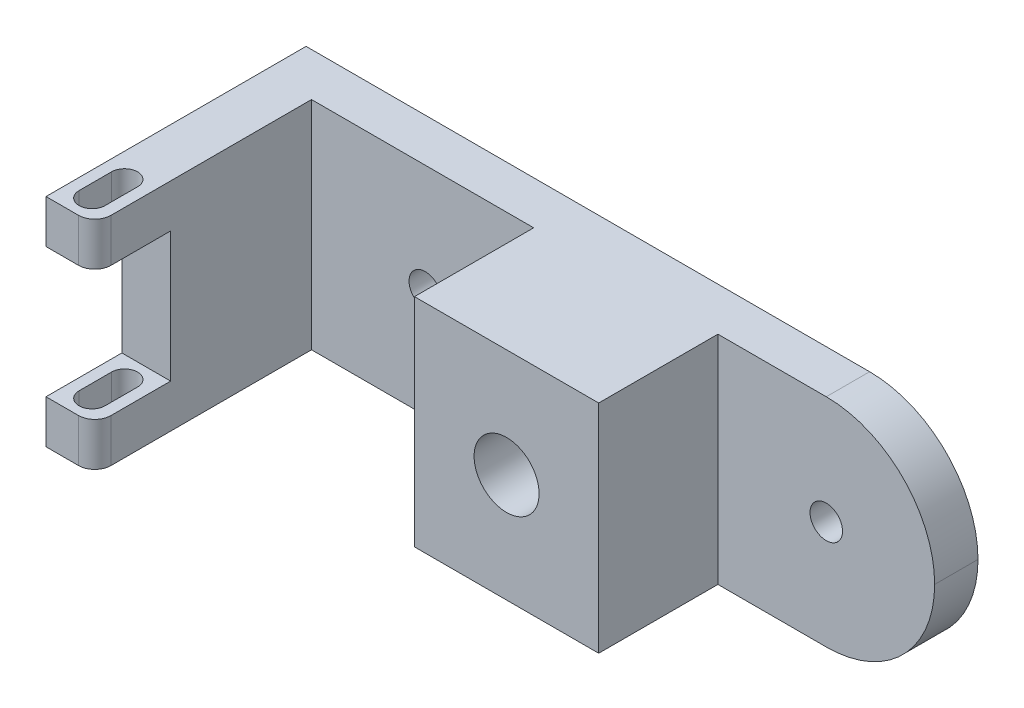
ISO-10303-21;
HEADER;
FILE_DESCRIPTION(('STEP AP214'),'2;1');
FILE_NAME('part.step','',(''),(''),'','','');
FILE_SCHEMA(('AUTOMOTIVE_DESIGN { 1 0 10303 214 1 1 1 1 }'));
ENDSEC;
DATA;
#1=APPLICATION_CONTEXT('core data for automotive mechanical design processes');
#2=APPLICATION_PROTOCOL_DEFINITION('international standard','automotive_design',2000,#1);
#3=PRODUCT_CONTEXT('',#1,'mechanical');
#4=PRODUCT('Part','Part','',(#3));
#5=PRODUCT_RELATED_PRODUCT_CATEGORY('part','',(#4));
#6=PRODUCT_DEFINITION_FORMATION('','',#4);
#7=PRODUCT_DEFINITION_CONTEXT('part definition',#1,'design');
#8=PRODUCT_DEFINITION('design','',#6,#7);
#9=PRODUCT_DEFINITION_SHAPE('','',#8);
#10=(LENGTH_UNIT() NAMED_UNIT(*) SI_UNIT(.MILLI.,.METRE.));
#11=(NAMED_UNIT(*) PLANE_ANGLE_UNIT() SI_UNIT($,.RADIAN.));
#12=(NAMED_UNIT(*) SI_UNIT($,.STERADIAN.) SOLID_ANGLE_UNIT());
#13=UNCERTAINTY_MEASURE_WITH_UNIT(LENGTH_MEASURE(1.E-05),#10,'distance_accuracy_value','');
#14=(GEOMETRIC_REPRESENTATION_CONTEXT(3) GLOBAL_UNCERTAINTY_ASSIGNED_CONTEXT((#13)) GLOBAL_UNIT_ASSIGNED_CONTEXT((#10,
#11,#12)) REPRESENTATION_CONTEXT('',''));
#15=CARTESIAN_POINT('',(0.,0.,0.));
#16=DIRECTION('',(0.,0.,1.));
#17=DIRECTION('',(1.,0.,0.));
#18=AXIS2_PLACEMENT_3D('',#15,#16,#17);
#19=CARTESIAN_POINT('',(0.,0.,17.));
#20=DIRECTION('',(0.,0.,1.));
#21=DIRECTION('',(1.,0.,0.));
#22=AXIS2_PLACEMENT_3D('',#19,#20,#21);
#23=PLANE('',#22);
#24=DIRECTION('',(0.,-1.,0.));
#25=VECTOR('',#24,1.);
#26=CARTESIAN_POINT('',(-33.5,10.,17.));
#27=LINE('',#26,#25);
#28=CARTESIAN_POINT('',(-33.5,6.,17.));
#29=VERTEX_POINT('',#28);
#30=CARTESIAN_POINT('',(-33.5,-6.,17.));
#31=VERTEX_POINT('',#30);
#32=EDGE_CURVE('E318',#29,#31,#27,.T.);
#33=ORIENTED_EDGE('',*,*,#32,.T.);
#34=DIRECTION('',(-1.,0.,0.));
#35=VECTOR('',#34,1.);
#36=CARTESIAN_POINT('',(-29.,-6.,17.));
#37=LINE('',#36,#35);
#38=CARTESIAN_POINT('',(-29.,-6.,17.));
#39=VERTEX_POINT('',#38);
#40=EDGE_CURVE('E274',#39,#31,#37,.T.);
#41=ORIENTED_EDGE('',*,*,#40,.F.);
#42=DIRECTION('',(0.,1.,0.));
#43=VECTOR('',#42,1.);
#44=CARTESIAN_POINT('',(-29.,10.,17.));
#45=LINE('',#44,#43);
#46=CARTESIAN_POINT('',(-29.,6.,17.));
#47=VERTEX_POINT('',#46);
#48=EDGE_CURVE('E321',#39,#47,#45,.T.);
#49=ORIENTED_EDGE('',*,*,#48,.T.);
#50=DIRECTION('',(1.,0.,0.));
#51=VECTOR('',#50,1.);
#52=CARTESIAN_POINT('',(-33.5,6.,17.));
#53=LINE('',#52,#51);
#54=EDGE_CURVE('E296',#29,#47,#53,.T.);
#55=ORIENTED_EDGE('',*,*,#54,.F.);
#56=EDGE_LOOP('',(#33,#41,#49,#55));
#57=FACE_BOUND('',#56,.T.);
#58=ADVANCED_FACE('F39',(#57),#23,.T.);
#59=CARTESIAN_POINT('',(0.,0.,4.));
#60=DIRECTION('',(0.,0.,1.));
#61=DIRECTION('',(1.,0.,0.));
#62=AXIS2_PLACEMENT_3D('',#59,#60,#61);
#63=PLANE('',#62);
#64=CARTESIAN_POINT('',(-18.5,0.,4.));
#65=DIRECTION('',(0.,0.,1.));
#66=DIRECTION('',(1.,0.,0.));
#67=AXIS2_PLACEMENT_3D('',#64,#65,#66);
#68=CIRCLE('',#67,1.5);
#69=CARTESIAN_POINT('',(-17.,0.,4.));
#70=VERTEX_POINT('',#69);
#71=EDGE_CURVE('E408',#70,#70,#68,.T.);
#72=ORIENTED_EDGE('',*,*,#71,.F.);
#73=EDGE_LOOP('',(#72));
#74=FACE_BOUND('',#73,.T.);
#75=DIRECTION('',(-1.,0.,0.));
#76=VECTOR('',#75,1.);
#77=CARTESIAN_POINT('',(-28.5,10.,4.));
#78=LINE('',#77,#76);
#79=CARTESIAN_POINT('',(-8.50000000000001,10.,4.));
#80=VERTEX_POINT('',#79);
#81=CARTESIAN_POINT('',(-29.,10.,4.));
#82=VERTEX_POINT('',#81);
#83=EDGE_CURVE('E420',#80,#82,#78,.T.);
#84=ORIENTED_EDGE('',*,*,#83,.T.);
#85=DIRECTION('',(0.,1.,0.));
#86=VECTOR('',#85,1.);
#87=CARTESIAN_POINT('',(-29.,10.,4.));
#88=LINE('',#87,#86);
#89=CARTESIAN_POINT('',(-29.,-10.,4.));
#90=VERTEX_POINT('',#89);
#91=EDGE_CURVE('E317',#90,#82,#88,.T.);
#92=ORIENTED_EDGE('',*,*,#91,.F.);
#93=DIRECTION('',(1.,0.,0.));
#94=VECTOR('',#93,1.);
#95=CARTESIAN_POINT('',(-28.5,-10.,4.));
#96=LINE('',#95,#94);
#97=CARTESIAN_POINT('',(-8.5,-10.,4.));
#98=VERTEX_POINT('',#97);
#99=EDGE_CURVE('E421',#90,#98,#96,.T.);
#100=ORIENTED_EDGE('',*,*,#99,.T.);
#101=DIRECTION('',(0.,-1.,0.));
#102=VECTOR('',#101,1.);
#103=CARTESIAN_POINT('',(-8.5,-10.,4.));
#104=LINE('',#103,#102);
#105=EDGE_CURVE('E358',#80,#98,#104,.T.);
#106=ORIENTED_EDGE('',*,*,#105,.F.);
#107=EDGE_LOOP('',(#84,#92,#100,#106));
#108=FACE_BOUND('',#107,.T.);
#109=ADVANCED_FACE('F567',(#74,#108),#63,.T.);
#110=DIRECTION('',(0.,1.,0.));
#111=VECTOR('',#110,1.);
#112=CARTESIAN_POINT('',(8.5,-10.,4.));
#113=LINE('',#112,#111);
#114=CARTESIAN_POINT('',(8.5,-10.,4.));
#115=VERTEX_POINT('',#114);
#116=CARTESIAN_POINT('',(8.49999999999999,10.,4.));
#117=VERTEX_POINT('',#116);
#118=EDGE_CURVE('E367',#115,#117,#113,.T.);
#119=ORIENTED_EDGE('',*,*,#118,.F.);
#120=CARTESIAN_POINT('',(18.5,-10.,4.));
#121=VERTEX_POINT('',#120);
#122=EDGE_CURVE('E419',#115,#121,#96,.T.);
#123=ORIENTED_EDGE('',*,*,#122,.T.);
#124=CARTESIAN_POINT('',(18.5,0.,4.));
#125=DIRECTION('',(0.,0.,1.));
#126=DIRECTION('',(1.,0.,0.));
#127=AXIS2_PLACEMENT_3D('',#124,#125,#126);
#128=CIRCLE('',#127,10.);
#129=CARTESIAN_POINT('',(28.5,0.,4.));
#130=VERTEX_POINT('',#129);
#131=EDGE_CURVE('E443',#121,#130,#128,.T.);
#132=ORIENTED_EDGE('',*,*,#131,.T.);
#133=CARTESIAN_POINT('',(18.5,0.,4.));
#134=DIRECTION('',(0.,0.,1.));
#135=DIRECTION('',(1.,0.,0.));
#136=AXIS2_PLACEMENT_3D('',#133,#134,#135);
#137=CIRCLE('',#136,10.);
#138=CARTESIAN_POINT('',(18.5,10.,4.));
#139=VERTEX_POINT('',#138);
#140=EDGE_CURVE('E440',#130,#139,#137,.T.);
#141=ORIENTED_EDGE('',*,*,#140,.T.);
#142=EDGE_CURVE('E416',#139,#117,#78,.T.);
#143=ORIENTED_EDGE('',*,*,#142,.T.);
#144=EDGE_LOOP('',(#119,#123,#132,#141,#143));
#145=FACE_BOUND('',#144,.T.);
#146=CARTESIAN_POINT('',(18.5,0.,4.));
#147=DIRECTION('',(0.,0.,1.));
#148=DIRECTION('',(1.,0.,0.));
#149=AXIS2_PLACEMENT_3D('',#146,#147,#148);
#150=CIRCLE('',#149,1.5);
#151=CARTESIAN_POINT('',(20.,0.,4.));
#152=VERTEX_POINT('',#151);
#153=EDGE_CURVE('E399',#152,#152,#150,.T.);
#154=ORIENTED_EDGE('',*,*,#153,.F.);
#155=EDGE_LOOP('',(#154));
#156=FACE_BOUND('',#155,.T.);
#157=ADVANCED_FACE('F536',(#145,#156),#63,.T.);
#158=CARTESIAN_POINT('',(0.,0.,0.));
#159=DIRECTION('',(0.,0.,1.));
#160=DIRECTION('',(1.,0.,0.));
#161=AXIS2_PLACEMENT_3D('',#158,#159,#160);
#162=PLANE('',#161);
#163=CARTESIAN_POINT('',(0.,0.,0.));
#164=DIRECTION('',(0.,0.,1.));
#165=DIRECTION('',(1.,0.,0.));
#166=AXIS2_PLACEMENT_3D('',#163,#164,#165);
#167=CIRCLE('',#166,1.5);
#168=CARTESIAN_POINT('',(1.5,0.,0.));
#169=VERTEX_POINT('',#168);
#170=EDGE_CURVE('E349',#169,#169,#167,.F.);
#171=ORIENTED_EDGE('',*,*,#170,.F.);
#172=EDGE_LOOP('',(#171));
#173=FACE_BOUND('',#172,.T.);
#174=CARTESIAN_POINT('',(18.5,0.,0.));
#175=DIRECTION('',(0.,0.,1.));
#176=DIRECTION('',(1.,0.,0.));
#177=AXIS2_PLACEMENT_3D('',#174,#175,#176);
#178=CIRCLE('',#177,10.);
#179=CARTESIAN_POINT('',(18.5,10.,0.));
#180=VERTEX_POINT('',#179);
#181=CARTESIAN_POINT('',(28.5,0.,0.));
#182=VERTEX_POINT('',#181);
#183=EDGE_CURVE('E424',#180,#182,#178,.F.);
#184=ORIENTED_EDGE('',*,*,#183,.T.);
#185=CARTESIAN_POINT('',(18.5,0.,0.));
#186=DIRECTION('',(0.,0.,1.));
#187=DIRECTION('',(1.,0.,0.));
#188=AXIS2_PLACEMENT_3D('',#185,#186,#187);
#189=CIRCLE('',#188,10.);
#190=CARTESIAN_POINT('',(18.5,-10.,0.));
#191=VERTEX_POINT('',#190);
#192=EDGE_CURVE('E433',#182,#191,#189,.F.);
#193=ORIENTED_EDGE('',*,*,#192,.T.);
#194=DIRECTION('',(1.,0.,0.));
#195=VECTOR('',#194,1.);
#196=CARTESIAN_POINT('',(-28.5,-10.,0.));
#197=LINE('',#196,#195);
#198=CARTESIAN_POINT('',(-33.5,-10.,0.));
#199=VERTEX_POINT('',#198);
#200=EDGE_CURVE('E427',#199,#191,#197,.T.);
#201=ORIENTED_EDGE('',*,*,#200,.F.);
#202=DIRECTION('',(0.,-1.,0.));
#203=VECTOR('',#202,1.);
#204=CARTESIAN_POINT('',(-33.5,10.,0.));
#205=LINE('',#204,#203);
#206=CARTESIAN_POINT('',(-33.5,10.,0.));
#207=VERTEX_POINT('',#206);
#208=EDGE_CURVE('E334',#207,#199,#205,.T.);
#209=ORIENTED_EDGE('',*,*,#208,.F.);
#210=DIRECTION('',(-1.,0.,0.));
#211=VECTOR('',#210,1.);
#212=CARTESIAN_POINT('',(-28.5,10.,0.));
#213=LINE('',#212,#211);
#214=EDGE_CURVE('E412',#180,#207,#213,.T.);
#215=ORIENTED_EDGE('',*,*,#214,.F.);
#216=EDGE_LOOP('',(#184,#193,#201,#209,#215));
#217=FACE_BOUND('',#216,.T.);
#218=CARTESIAN_POINT('',(-18.5,0.,0.));
#219=DIRECTION('',(0.,0.,1.));
#220=DIRECTION('',(1.,0.,0.));
#221=AXIS2_PLACEMENT_3D('',#218,#219,#220);
#222=CIRCLE('',#221,1.5);
#223=CARTESIAN_POINT('',(-17.,0.,0.));
#224=VERTEX_POINT('',#223);
#225=EDGE_CURVE('E403',#224,#224,#222,.T.);
#226=ORIENTED_EDGE('',*,*,#225,.T.);
#227=EDGE_LOOP('',(#226));
#228=FACE_BOUND('',#227,.T.);
#229=CARTESIAN_POINT('',(18.5,0.,0.));
#230=DIRECTION('',(0.,0.,1.));
#231=DIRECTION('',(1.,0.,0.));
#232=AXIS2_PLACEMENT_3D('',#229,#230,#231);
#233=CIRCLE('',#232,1.5);
#234=CARTESIAN_POINT('',(20.,0.,0.));
#235=VERTEX_POINT('',#234);
#236=EDGE_CURVE('E404',#235,#235,#233,.T.);
#237=ORIENTED_EDGE('',*,*,#236,.T.);
#238=EDGE_LOOP('',(#237));
#239=FACE_BOUND('',#238,.T.);
#240=ADVANCED_FACE('F544',(#173,#217,#228,#239),#162,.F.);
#241=CARTESIAN_POINT('',(-28.5,10.,4.));
#242=DIRECTION('',(0.,-1.,0.));
#243=DIRECTION('',(0.,0.,-1.));
#244=AXIS2_PLACEMENT_3D('',#241,#242,#243);
#245=PLANE('',#244);
#246=DIRECTION('',(0.,0.,-1.));
#247=VECTOR('',#246,1.);
#248=CARTESIAN_POINT('',(-30.05,10.,22.));
#249=LINE('',#248,#247);
#250=CARTESIAN_POINT('',(-30.05,10.,22.));
#251=VERTEX_POINT('',#250);
#252=CARTESIAN_POINT('',(-30.05,10.,19.));
#253=VERTEX_POINT('',#252);
#254=EDGE_CURVE('E223',#251,#253,#249,.T.);
#255=ORIENTED_EDGE('',*,*,#254,.F.);
#256=CARTESIAN_POINT('',(-31.25,10.,22.));
#257=DIRECTION('',(0.,1.,0.));
#258=DIRECTION('',(0.,0.,1.));
#259=AXIS2_PLACEMENT_3D('',#256,#257,#258);
#260=CIRCLE('',#259,1.2);
#261=CARTESIAN_POINT('',(-32.45,10.,22.));
#262=VERTEX_POINT('',#261);
#263=EDGE_CURVE('E230',#262,#251,#260,.T.);
#264=ORIENTED_EDGE('',*,*,#263,.F.);
#265=DIRECTION('',(0.,0.,1.));
#266=VECTOR('',#265,1.);
#267=CARTESIAN_POINT('',(-32.45,10.,22.));
#268=LINE('',#267,#266);
#269=CARTESIAN_POINT('',(-32.45,10.,19.));
#270=VERTEX_POINT('',#269);
#271=EDGE_CURVE('E235',#270,#262,#268,.T.);
#272=ORIENTED_EDGE('',*,*,#271,.F.);
#273=CARTESIAN_POINT('',(-31.25,10.,19.));
#274=DIRECTION('',(0.,1.,0.));
#275=DIRECTION('',(0.,0.,1.));
#276=AXIS2_PLACEMENT_3D('',#273,#274,#275);
#277=CIRCLE('',#276,1.2);
#278=EDGE_CURVE('E211',#253,#270,#277,.T.);
#279=ORIENTED_EDGE('',*,*,#278,.F.);
#280=EDGE_LOOP('',(#255,#264,#272,#279));
#281=FACE_BOUND('',#280,.T.);
#282=DIRECTION('',(-1.,0.,0.));
#283=VECTOR('',#282,1.);
#284=CARTESIAN_POINT('',(-33.5,10.,24.));
#285=LINE('',#284,#283);
#286=CARTESIAN_POINT('',(-30.5,10.,24.));
#287=VERTEX_POINT('',#286);
#288=CARTESIAN_POINT('',(-33.5,10.,24.));
#289=VERTEX_POINT('',#288);
#290=EDGE_CURVE('E304',#287,#289,#285,.T.);
#291=ORIENTED_EDGE('',*,*,#290,.F.);
#292=CARTESIAN_POINT('',(-30.5,10.,22.5));
#293=DIRECTION('',(0.,-1.,0.));
#294=DIRECTION('',(0.,0.,-1.));
#295=AXIS2_PLACEMENT_3D('',#292,#293,#294);
#296=CIRCLE('',#295,1.5);
#297=CARTESIAN_POINT('',(-29.,10.,22.5));
#298=VERTEX_POINT('',#297);
#299=EDGE_CURVE('E48',#287,#298,#296,.F.);
#300=ORIENTED_EDGE('',*,*,#299,.T.);
#301=DIRECTION('',(0.,0.,-1.));
#302=VECTOR('',#301,1.);
#303=CARTESIAN_POINT('',(-29.,10.,17.));
#304=LINE('',#303,#302);
#305=EDGE_CURVE('E325',#298,#82,#304,.T.);
#306=ORIENTED_EDGE('',*,*,#305,.T.);
#307=ORIENTED_EDGE('',*,*,#83,.F.);
#308=DIRECTION('',(0.,0.,-1.));
#309=VECTOR('',#308,1.);
#310=CARTESIAN_POINT('',(-8.5,10.,15.));
#311=LINE('',#310,#309);
#312=CARTESIAN_POINT('',(-8.5,10.,15.));
#313=VERTEX_POINT('',#312);
#314=EDGE_CURVE('E376',#313,#80,#311,.T.);
#315=ORIENTED_EDGE('',*,*,#314,.F.);
#316=DIRECTION('',(-1.,0.,0.));
#317=VECTOR('',#316,1.);
#318=CARTESIAN_POINT('',(-8.5,10.,15.));
#319=LINE('',#318,#317);
#320=CARTESIAN_POINT('',(8.49999999999999,10.,15.));
#321=VERTEX_POINT('',#320);
#322=EDGE_CURVE('E373',#321,#313,#319,.T.);
#323=ORIENTED_EDGE('',*,*,#322,.F.);
#324=DIRECTION('',(0.,0.,-1.));
#325=VECTOR('',#324,1.);
#326=CARTESIAN_POINT('',(8.49999999999999,10.,15.));
#327=LINE('',#326,#325);
#328=EDGE_CURVE('E386',#321,#117,#327,.T.);
#329=ORIENTED_EDGE('',*,*,#328,.T.);
#330=ORIENTED_EDGE('',*,*,#142,.F.);
#331=DIRECTION('',(0.,0.,-1.));
#332=VECTOR('',#331,1.);
#333=CARTESIAN_POINT('',(18.5,10.,4.));
#334=LINE('',#333,#332);
#335=EDGE_CURVE('E446',#139,#180,#334,.T.);
#336=ORIENTED_EDGE('',*,*,#335,.T.);
#337=ORIENTED_EDGE('',*,*,#214,.T.);
#338=DIRECTION('',(0.,0.,-1.));
#339=VECTOR('',#338,1.);
#340=CARTESIAN_POINT('',(-33.5,10.,0.));
#341=LINE('',#340,#339);
#342=EDGE_CURVE('E341',#289,#207,#341,.T.);
#343=ORIENTED_EDGE('',*,*,#342,.F.);
#344=EDGE_LOOP('',(#291,#300,#306,#307,#315,#323,#329,#330,#336,#337,#343));
#345=FACE_BOUND('',#344,.T.);
#346=ADVANCED_FACE('F232',(#281,#345),#245,.F.);
#347=CARTESIAN_POINT('',(-28.5,-10.,4.));
#348=DIRECTION('',(0.,1.,0.));
#349=DIRECTION('',(0.,0.,1.));
#350=AXIS2_PLACEMENT_3D('',#347,#348,#349);
#351=PLANE('',#350);
#352=DIRECTION('',(0.,0.,-1.));
#353=VECTOR('',#352,1.);
#354=CARTESIAN_POINT('',(-32.45,-10.,22.));
#355=LINE('',#354,#353);
#356=CARTESIAN_POINT('',(-32.45,-10.,22.));
#357=VERTEX_POINT('',#356);
#358=CARTESIAN_POINT('',(-32.45,-10.,19.));
#359=VERTEX_POINT('',#358);
#360=EDGE_CURVE('E616',#357,#359,#355,.T.);
#361=ORIENTED_EDGE('',*,*,#360,.F.);
#362=CARTESIAN_POINT('',(-31.25,-10.,22.));
#363=DIRECTION('',(0.,1.,0.));
#364=DIRECTION('',(0.,0.,1.));
#365=AXIS2_PLACEMENT_3D('',#362,#363,#364);
#366=CIRCLE('',#365,1.2);
#367=CARTESIAN_POINT('',(-30.05,-10.,22.));
#368=VERTEX_POINT('',#367);
#369=EDGE_CURVE('E261',#368,#357,#366,.F.);
#370=ORIENTED_EDGE('',*,*,#369,.F.);
#371=DIRECTION('',(0.,0.,1.));
#372=VECTOR('',#371,1.);
#373=CARTESIAN_POINT('',(-30.05,-10.,22.));
#374=LINE('',#373,#372);
#375=CARTESIAN_POINT('',(-30.05,-10.,19.));
#376=VERTEX_POINT('',#375);
#377=EDGE_CURVE('E257',#376,#368,#374,.T.);
#378=ORIENTED_EDGE('',*,*,#377,.F.);
#379=CARTESIAN_POINT('',(-31.25,-10.,19.));
#380=DIRECTION('',(0.,1.,0.));
#381=DIRECTION('',(0.,0.,1.));
#382=AXIS2_PLACEMENT_3D('',#379,#380,#381);
#383=CIRCLE('',#382,1.2);
#384=EDGE_CURVE('E246',#359,#376,#383,.F.);
#385=ORIENTED_EDGE('',*,*,#384,.F.);
#386=EDGE_LOOP('',(#361,#370,#378,#385));
#387=FACE_BOUND('',#386,.T.);
#388=DIRECTION('',(0.,0.,-1.));
#389=VECTOR('',#388,1.);
#390=CARTESIAN_POINT('',(-29.,-10.,17.));
#391=LINE('',#390,#389);
#392=CARTESIAN_POINT('',(-29.,-10.,22.5));
#393=VERTEX_POINT('',#392);
#394=EDGE_CURVE('E331',#393,#90,#391,.T.);
#395=ORIENTED_EDGE('',*,*,#394,.F.);
#396=CARTESIAN_POINT('',(-30.5,-10.,22.5));
#397=DIRECTION('',(0.,1.,0.));
#398=DIRECTION('',(0.,0.,1.));
#399=AXIS2_PLACEMENT_3D('',#396,#397,#398);
#400=CIRCLE('',#399,1.5);
#401=CARTESIAN_POINT('',(-30.5,-10.,24.));
#402=VERTEX_POINT('',#401);
#403=EDGE_CURVE('E481',#393,#402,#400,.F.);
#404=ORIENTED_EDGE('',*,*,#403,.T.);
#405=DIRECTION('',(1.,0.,0.));
#406=VECTOR('',#405,1.);
#407=CARTESIAN_POINT('',(-29.,-10.,24.));
#408=LINE('',#407,#406);
#409=CARTESIAN_POINT('',(-33.5,-10.,24.));
#410=VERTEX_POINT('',#409);
#411=EDGE_CURVE('E282',#410,#402,#408,.T.);
#412=ORIENTED_EDGE('',*,*,#411,.F.);
#413=DIRECTION('',(0.,0.,1.));
#414=VECTOR('',#413,1.);
#415=CARTESIAN_POINT('',(-33.5,-10.,0.));
#416=LINE('',#415,#414);
#417=EDGE_CURVE('E338',#199,#410,#416,.T.);
#418=ORIENTED_EDGE('',*,*,#417,.F.);
#419=ORIENTED_EDGE('',*,*,#200,.T.);
#420=DIRECTION('',(0.,0.,-1.));
#421=VECTOR('',#420,1.);
#422=CARTESIAN_POINT('',(18.5,-10.,4.));
#423=LINE('',#422,#421);
#424=EDGE_CURVE('E436',#191,#121,#423,.F.);
#425=ORIENTED_EDGE('',*,*,#424,.T.);
#426=ORIENTED_EDGE('',*,*,#122,.F.);
#427=DIRECTION('',(0.,0.,-1.));
#428=VECTOR('',#427,1.);
#429=CARTESIAN_POINT('',(8.5,-10.,15.));
#430=LINE('',#429,#428);
#431=CARTESIAN_POINT('',(8.5,-10.,15.));
#432=VERTEX_POINT('',#431);
#433=EDGE_CURVE('E390',#432,#115,#430,.T.);
#434=ORIENTED_EDGE('',*,*,#433,.F.);
#435=DIRECTION('',(1.,0.,0.));
#436=VECTOR('',#435,1.);
#437=CARTESIAN_POINT('',(-8.5,-10.,15.));
#438=LINE('',#437,#436);
#439=CARTESIAN_POINT('',(-8.5,-10.,15.));
#440=VERTEX_POINT('',#439);
#441=EDGE_CURVE('E366',#440,#432,#438,.T.);
#442=ORIENTED_EDGE('',*,*,#441,.F.);
#443=DIRECTION('',(0.,0.,-1.));
#444=VECTOR('',#443,1.);
#445=CARTESIAN_POINT('',(-8.5,-10.,15.));
#446=LINE('',#445,#444);
#447=EDGE_CURVE('E394',#440,#98,#446,.T.);
#448=ORIENTED_EDGE('',*,*,#447,.T.);
#449=ORIENTED_EDGE('',*,*,#99,.F.);
#450=EDGE_LOOP('',(#395,#404,#412,#418,#419,#425,#426,#434,#442,#448,#449));
#451=FACE_BOUND('',#450,.T.);
#452=ADVANCED_FACE('F520',(#387,#451),#351,.F.);
#453=CARTESIAN_POINT('',(-18.5,0.,4.));
#454=DIRECTION('',(0.,0.,-1.));
#455=DIRECTION('',(-1.,0.,0.));
#456=AXIS2_PLACEMENT_3D('',#453,#454,#455);
#457=CYLINDRICAL_SURFACE('',#456,1.5);
#458=ORIENTED_EDGE('',*,*,#71,.T.);
#459=EDGE_LOOP('',(#458));
#460=FACE_BOUND('',#459,.T.);
#461=ORIENTED_EDGE('',*,*,#225,.F.);
#462=EDGE_LOOP('',(#461));
#463=FACE_BOUND('',#462,.T.);
#464=ADVANCED_FACE('F555',(#460,#463),#457,.F.);
#465=CARTESIAN_POINT('',(18.5,0.,4.));
#466=DIRECTION('',(0.,0.,-1.));
#467=DIRECTION('',(-1.,0.,0.));
#468=AXIS2_PLACEMENT_3D('',#465,#466,#467);
#469=CYLINDRICAL_SURFACE('',#468,1.5);
#470=ORIENTED_EDGE('',*,*,#153,.T.);
#471=EDGE_LOOP('',(#470));
#472=FACE_BOUND('',#471,.T.);
#473=ORIENTED_EDGE('',*,*,#236,.F.);
#474=EDGE_LOOP('',(#473));
#475=FACE_BOUND('',#474,.T.);
#476=ADVANCED_FACE('F553',(#472,#475),#469,.F.);
#477=CARTESIAN_POINT('',(18.5,0.,4.));
#478=DIRECTION('',(0.,0.,-1.));
#479=DIRECTION('',(-1.,0.,0.));
#480=AXIS2_PLACEMENT_3D('',#477,#478,#479);
#481=CYLINDRICAL_SURFACE('',#480,10.);
#482=ORIENTED_EDGE('',*,*,#335,.F.);
#483=ORIENTED_EDGE('',*,*,#140,.F.);
#484=DIRECTION('',(0.,0.,-1.));
#485=VECTOR('',#484,1.);
#486=CARTESIAN_POINT('',(28.5,0.,4.));
#487=LINE('',#486,#485);
#488=EDGE_CURVE('E398',#182,#130,#487,.F.);
#489=ORIENTED_EDGE('',*,*,#488,.F.);
#490=ORIENTED_EDGE('',*,*,#183,.F.);
#491=EDGE_LOOP('',(#482,#483,#489,#490));
#492=FACE_BOUND('',#491,.T.);
#493=ADVANCED_FACE('F541',(#492),#481,.T.);
#494=CARTESIAN_POINT('',(18.5,0.,4.));
#495=DIRECTION('',(0.,0.,-1.));
#496=DIRECTION('',(-1.,0.,0.));
#497=AXIS2_PLACEMENT_3D('',#494,#495,#496);
#498=CYLINDRICAL_SURFACE('',#497,10.);
#499=ORIENTED_EDGE('',*,*,#131,.F.);
#500=ORIENTED_EDGE('',*,*,#424,.F.);
#501=ORIENTED_EDGE('',*,*,#192,.F.);
#502=ORIENTED_EDGE('',*,*,#488,.T.);
#503=EDGE_LOOP('',(#499,#500,#501,#502));
#504=FACE_BOUND('',#503,.T.);
#505=ADVANCED_FACE('F532',(#504),#498,.T.);
#506=CARTESIAN_POINT('',(-8.5,-10.,15.));
#507=DIRECTION('',(1.,0.,0.));
#508=DIRECTION('',(0.,0.,-1.));
#509=AXIS2_PLACEMENT_3D('',#506,#507,#508);
#510=PLANE('',#509);
#511=ORIENTED_EDGE('',*,*,#105,.T.);
#512=ORIENTED_EDGE('',*,*,#447,.F.);
#513=DIRECTION('',(0.,-1.,0.));
#514=VECTOR('',#513,1.);
#515=CARTESIAN_POINT('',(-8.5,-10.,15.));
#516=LINE('',#515,#514);
#517=EDGE_CURVE('E362',#313,#440,#516,.T.);
#518=ORIENTED_EDGE('',*,*,#517,.F.);
#519=ORIENTED_EDGE('',*,*,#314,.T.);
#520=EDGE_LOOP('',(#511,#512,#518,#519));
#521=FACE_BOUND('',#520,.T.);
#522=ADVANCED_FACE('F599',(#521),#510,.F.);
#523=CARTESIAN_POINT('',(8.5,-10.,15.));
#524=DIRECTION('',(-1.,0.,0.));
#525=DIRECTION('',(0.,-1.,0.));
#526=AXIS2_PLACEMENT_3D('',#523,#524,#525);
#527=PLANE('',#526);
#528=ORIENTED_EDGE('',*,*,#118,.T.);
#529=ORIENTED_EDGE('',*,*,#328,.F.);
#530=DIRECTION('',(0.,1.,0.));
#531=VECTOR('',#530,1.);
#532=CARTESIAN_POINT('',(8.5,-10.,15.));
#533=LINE('',#532,#531);
#534=EDGE_CURVE('E370',#432,#321,#533,.T.);
#535=ORIENTED_EDGE('',*,*,#534,.F.);
#536=ORIENTED_EDGE('',*,*,#433,.T.);
#537=EDGE_LOOP('',(#528,#529,#535,#536));
#538=FACE_BOUND('',#537,.T.);
#539=ADVANCED_FACE('F596',(#538),#527,.F.);
#540=CARTESIAN_POINT('',(0.,0.,15.));
#541=DIRECTION('',(0.,0.,-1.));
#542=DIRECTION('',(-1.,0.,0.));
#543=AXIS2_PLACEMENT_3D('',#540,#541,#542);
#544=PLANE('',#543);
#545=CARTESIAN_POINT('',(0.,0.,15.));
#546=DIRECTION('',(0.,0.,1.));
#547=DIRECTION('',(1.,0.,0.));
#548=AXIS2_PLACEMENT_3D('',#545,#546,#547);
#549=CIRCLE('',#548,3.);
#550=CARTESIAN_POINT('',(3.,0.,15.));
#551=VERTEX_POINT('',#550);
#552=EDGE_CURVE('E353',#551,#551,#549,.T.);
#553=ORIENTED_EDGE('',*,*,#552,.F.);
#554=EDGE_LOOP('',(#553));
#555=FACE_BOUND('',#554,.T.);
#556=ORIENTED_EDGE('',*,*,#517,.T.);
#557=ORIENTED_EDGE('',*,*,#441,.T.);
#558=ORIENTED_EDGE('',*,*,#534,.T.);
#559=ORIENTED_EDGE('',*,*,#322,.T.);
#560=EDGE_LOOP('',(#556,#557,#558,#559));
#561=FACE_BOUND('',#560,.T.);
#562=ADVANCED_FACE('F592',(#555,#561),#544,.F.);
#563=CARTESIAN_POINT('',(0.,0.,6.));
#564=DIRECTION('',(0.,0.,1.));
#565=DIRECTION('',(1.,0.,0.));
#566=AXIS2_PLACEMENT_3D('',#563,#564,#565);
#567=CYLINDRICAL_SURFACE('',#566,3.);
#568=CARTESIAN_POINT('',(0.,0.,6.));
#569=DIRECTION('',(0.,0.,1.));
#570=DIRECTION('',(1.,0.,0.));
#571=AXIS2_PLACEMENT_3D('',#568,#569,#570);
#572=CIRCLE('',#571,3.);
#573=CARTESIAN_POINT('',(3.,0.,6.));
#574=VERTEX_POINT('',#573);
#575=EDGE_CURVE('E354',#574,#574,#572,.T.);
#576=ORIENTED_EDGE('',*,*,#575,.F.);
#577=EDGE_LOOP('',(#576));
#578=FACE_BOUND('',#577,.T.);
#579=ORIENTED_EDGE('',*,*,#552,.T.);
#580=EDGE_LOOP('',(#579));
#581=FACE_BOUND('',#580,.T.);
#582=ADVANCED_FACE('F588',(#578,#581),#567,.F.);
#583=CARTESIAN_POINT('',(0.,0.,6.));
#584=DIRECTION('',(0.,0.,1.));
#585=DIRECTION('',(1.,0.,0.));
#586=AXIS2_PLACEMENT_3D('',#583,#584,#585);
#587=PLANE('',#586);
#588=CARTESIAN_POINT('',(0.,0.,6.));
#589=DIRECTION('',(0.,0.,1.));
#590=DIRECTION('',(1.,0.,0.));
#591=AXIS2_PLACEMENT_3D('',#588,#589,#590);
#592=CIRCLE('',#591,1.5);
#593=CARTESIAN_POINT('',(1.5,0.,6.));
#594=VERTEX_POINT('',#593);
#595=EDGE_CURVE('E345',#594,#594,#592,.T.);
#596=ORIENTED_EDGE('',*,*,#595,.F.);
#597=EDGE_LOOP('',(#596));
#598=FACE_BOUND('',#597,.T.);
#599=ORIENTED_EDGE('',*,*,#575,.T.);
#600=EDGE_LOOP('',(#599));
#601=FACE_BOUND('',#600,.T.);
#602=ADVANCED_FACE('F584',(#598,#601),#587,.T.);
#603=CARTESIAN_POINT('',(0.,0.,-4.24264068711928));
#604=DIRECTION('',(0.,0.,1.));
#605=DIRECTION('',(1.,0.,0.));
#606=AXIS2_PLACEMENT_3D('',#603,#604,#605);
#607=CYLINDRICAL_SURFACE('',#606,1.5);
#608=ORIENTED_EDGE('',*,*,#170,.T.);
#609=EDGE_LOOP('',(#608));
#610=FACE_BOUND('',#609,.T.);
#611=ORIENTED_EDGE('',*,*,#595,.T.);
#612=EDGE_LOOP('',(#611));
#613=FACE_BOUND('',#612,.T.);
#614=ADVANCED_FACE('F581',(#610,#613),#607,.F.);
#615=CARTESIAN_POINT('',(-33.5,0.,0.));
#616=DIRECTION('',(-1.,0.,0.));
#617=DIRECTION('',(0.,-1.,0.));
#618=AXIS2_PLACEMENT_3D('',#615,#616,#617);
#619=PLANE('',#618);
#620=ORIENTED_EDGE('',*,*,#208,.T.);
#621=ORIENTED_EDGE('',*,*,#417,.T.);
#622=DIRECTION('',(0.,-1.,0.));
#623=VECTOR('',#622,1.);
#624=CARTESIAN_POINT('',(-33.5,-10.,24.));
#625=LINE('',#624,#623);
#626=CARTESIAN_POINT('',(-33.5,-6.,24.));
#627=VERTEX_POINT('',#626);
#628=EDGE_CURVE('E278',#627,#410,#625,.T.);
#629=ORIENTED_EDGE('',*,*,#628,.F.);
#630=DIRECTION('',(0.,0.,-1.));
#631=VECTOR('',#630,1.);
#632=CARTESIAN_POINT('',(-33.5,-6.,24.));
#633=LINE('',#632,#631);
#634=EDGE_CURVE('E286',#627,#31,#633,.T.);
#635=ORIENTED_EDGE('',*,*,#634,.T.);
#636=ORIENTED_EDGE('',*,*,#32,.F.);
#637=DIRECTION('',(0.,0.,-1.));
#638=VECTOR('',#637,1.);
#639=CARTESIAN_POINT('',(-33.5,6.,24.));
#640=LINE('',#639,#638);
#641=CARTESIAN_POINT('',(-33.5,6.,24.));
#642=VERTEX_POINT('',#641);
#643=EDGE_CURVE('E313',#642,#29,#640,.T.);
#644=ORIENTED_EDGE('',*,*,#643,.F.);
#645=DIRECTION('',(0.,-1.,0.));
#646=VECTOR('',#645,1.);
#647=CARTESIAN_POINT('',(-33.5,10.,24.));
#648=LINE('',#647,#646);
#649=EDGE_CURVE('E297',#289,#642,#648,.T.);
#650=ORIENTED_EDGE('',*,*,#649,.F.);
#651=ORIENTED_EDGE('',*,*,#342,.T.);
#652=EDGE_LOOP('',(#620,#621,#629,#635,#636,#644,#650,#651));
#653=FACE_BOUND('',#652,.T.);
#654=ADVANCED_FACE('F503',(#653),#619,.T.);
#655=CARTESIAN_POINT('',(-29.,10.,17.));
#656=DIRECTION('',(-1.,0.,0.));
#657=DIRECTION('',(0.,-1.,0.));
#658=AXIS2_PLACEMENT_3D('',#655,#656,#657);
#659=PLANE('',#658);
#660=DIRECTION('',(0.,0.,-1.));
#661=VECTOR('',#660,1.);
#662=CARTESIAN_POINT('',(-29.,-6.,24.));
#663=LINE('',#662,#661);
#664=CARTESIAN_POINT('',(-29.,-6.,22.5));
#665=VERTEX_POINT('',#664);
#666=EDGE_CURVE('E293',#665,#39,#663,.T.);
#667=ORIENTED_EDGE('',*,*,#666,.F.);
#668=DIRECTION('',(0.,1.,0.));
#669=VECTOR('',#668,1.);
#670=CARTESIAN_POINT('',(-29.,-10.,22.5));
#671=LINE('',#670,#669);
#672=EDGE_CURVE('E478',#665,#393,#671,.F.);
#673=ORIENTED_EDGE('',*,*,#672,.T.);
#674=ORIENTED_EDGE('',*,*,#394,.T.);
#675=ORIENTED_EDGE('',*,*,#91,.T.);
#676=ORIENTED_EDGE('',*,*,#305,.F.);
#677=DIRECTION('',(0.,1.,0.));
#678=VECTOR('',#677,1.);
#679=CARTESIAN_POINT('',(-29.,6.,22.5));
#680=LINE('',#679,#678);
#681=CARTESIAN_POINT('',(-29.,6.,22.5));
#682=VERTEX_POINT('',#681);
#683=EDGE_CURVE('E475',#298,#682,#680,.F.);
#684=ORIENTED_EDGE('',*,*,#683,.T.);
#685=DIRECTION('',(0.,0.,-1.));
#686=VECTOR('',#685,1.);
#687=CARTESIAN_POINT('',(-29.,6.,24.));
#688=LINE('',#687,#686);
#689=EDGE_CURVE('E307',#682,#47,#688,.T.);
#690=ORIENTED_EDGE('',*,*,#689,.T.);
#691=ORIENTED_EDGE('',*,*,#48,.F.);
#692=EDGE_LOOP('',(#667,#673,#674,#675,#676,#684,#690,#691));
#693=FACE_BOUND('',#692,.T.);
#694=ADVANCED_FACE('F493',(#693),#659,.F.);
#695=CARTESIAN_POINT('',(-33.5,6.,24.));
#696=DIRECTION('',(0.,1.,0.));
#697=DIRECTION('',(0.,0.,1.));
#698=AXIS2_PLACEMENT_3D('',#695,#696,#697);
#699=PLANE('',#698);
#700=DIRECTION('',(0.,0.,1.));
#701=VECTOR('',#700,1.);
#702=CARTESIAN_POINT('',(-32.45,6.,24.));
#703=LINE('',#702,#701);
#704=CARTESIAN_POINT('',(-32.45,5.99999999999999,19.));
#705=VERTEX_POINT('',#704);
#706=CARTESIAN_POINT('',(-32.45,5.99999999999999,22.));
#707=VERTEX_POINT('',#706);
#708=EDGE_CURVE('E266',#705,#707,#703,.T.);
#709=ORIENTED_EDGE('',*,*,#708,.T.);
#710=CARTESIAN_POINT('',(-31.25,6.,22.));
#711=DIRECTION('',(0.,1.,0.));
#712=DIRECTION('',(0.,0.,1.));
#713=AXIS2_PLACEMENT_3D('',#710,#711,#712);
#714=CIRCLE('',#713,1.2);
#715=CARTESIAN_POINT('',(-30.05,5.99999999999999,22.));
#716=VERTEX_POINT('',#715);
#717=EDGE_CURVE('E270',#707,#716,#714,.T.);
#718=ORIENTED_EDGE('',*,*,#717,.T.);
#719=DIRECTION('',(0.,0.,-1.));
#720=VECTOR('',#719,1.);
#721=CARTESIAN_POINT('',(-30.05,6.,24.));
#722=LINE('',#721,#720);
#723=CARTESIAN_POINT('',(-30.05,6.,19.));
#724=VERTEX_POINT('',#723);
#725=EDGE_CURVE('E260',#716,#724,#722,.T.);
#726=ORIENTED_EDGE('',*,*,#725,.T.);
#727=CARTESIAN_POINT('',(-31.25,6.,19.));
#728=DIRECTION('',(0.,1.,0.));
#729=DIRECTION('',(0.,0.,1.));
#730=AXIS2_PLACEMENT_3D('',#727,#728,#729);
#731=CIRCLE('',#730,1.2);
#732=EDGE_CURVE('E214',#724,#705,#731,.T.);
#733=ORIENTED_EDGE('',*,*,#732,.T.);
#734=EDGE_LOOP('',(#709,#718,#726,#733));
#735=FACE_BOUND('',#734,.T.);
#736=ORIENTED_EDGE('',*,*,#689,.F.);
#737=CARTESIAN_POINT('',(-30.5,6.,22.5));
#738=DIRECTION('',(0.,1.,0.));
#739=DIRECTION('',(0.,0.,1.));
#740=AXIS2_PLACEMENT_3D('',#737,#738,#739);
#741=CIRCLE('',#740,1.5);
#742=CARTESIAN_POINT('',(-30.5,6.,24.));
#743=VERTEX_POINT('',#742);
#744=EDGE_CURVE('E11',#682,#743,#741,.F.);
#745=ORIENTED_EDGE('',*,*,#744,.T.);
#746=DIRECTION('',(1.,0.,0.));
#747=VECTOR('',#746,1.);
#748=CARTESIAN_POINT('',(-33.5,6.,24.));
#749=LINE('',#748,#747);
#750=EDGE_CURVE('E301',#642,#743,#749,.T.);
#751=ORIENTED_EDGE('',*,*,#750,.F.);
#752=ORIENTED_EDGE('',*,*,#643,.T.);
#753=ORIENTED_EDGE('',*,*,#54,.T.);
#754=EDGE_LOOP('',(#736,#745,#751,#752,#753));
#755=FACE_BOUND('',#754,.T.);
#756=ADVANCED_FACE('F500',(#735,#755),#699,.F.);
#757=CARTESIAN_POINT('',(0.,0.,24.));
#758=DIRECTION('',(0.,0.,1.));
#759=DIRECTION('',(1.,0.,0.));
#760=AXIS2_PLACEMENT_3D('',#757,#758,#759);
#761=PLANE('',#760);
#762=ORIENTED_EDGE('',*,*,#750,.T.);
#763=DIRECTION('',(0.,1.,0.));
#764=VECTOR('',#763,1.);
#765=CARTESIAN_POINT('',(-30.5,10.,24.));
#766=LINE('',#765,#764);
#767=EDGE_CURVE('E484',#743,#287,#766,.T.);
#768=ORIENTED_EDGE('',*,*,#767,.T.);
#769=ORIENTED_EDGE('',*,*,#290,.T.);
#770=ORIENTED_EDGE('',*,*,#649,.T.);
#771=EDGE_LOOP('',(#762,#768,#769,#770));
#772=FACE_BOUND('',#771,.T.);
#773=ADVANCED_FACE('F497',(#772),#761,.T.);
#774=CARTESIAN_POINT('',(-29.,-6.,24.));
#775=DIRECTION('',(0.,-1.,0.));
#776=DIRECTION('',(0.,0.,-1.));
#777=AXIS2_PLACEMENT_3D('',#774,#775,#776);
#778=PLANE('',#777);
#779=DIRECTION('',(0.,0.,1.));
#780=VECTOR('',#779,1.);
#781=CARTESIAN_POINT('',(-30.05,-6.,24.));
#782=LINE('',#781,#780);
#783=CARTESIAN_POINT('',(-30.05,-6.,19.));
#784=VERTEX_POINT('',#783);
#785=CARTESIAN_POINT('',(-30.05,-6.,22.));
#786=VERTEX_POINT('',#785);
#787=EDGE_CURVE('E449',#784,#786,#782,.T.);
#788=ORIENTED_EDGE('',*,*,#787,.T.);
#789=CARTESIAN_POINT('',(-31.25,-6.,22.));
#790=DIRECTION('',(0.,-1.,0.));
#791=DIRECTION('',(0.,0.,-1.));
#792=AXIS2_PLACEMENT_3D('',#789,#790,#791);
#793=CIRCLE('',#792,1.2);
#794=CARTESIAN_POINT('',(-32.45,-6.,22.));
#795=VERTEX_POINT('',#794);
#796=EDGE_CURVE('E464',#786,#795,#793,.T.);
#797=ORIENTED_EDGE('',*,*,#796,.T.);
#798=DIRECTION('',(0.,0.,-1.));
#799=VECTOR('',#798,1.);
#800=CARTESIAN_POINT('',(-32.45,-6.,24.));
#801=LINE('',#800,#799);
#802=CARTESIAN_POINT('',(-32.45,-6.,19.));
#803=VERTEX_POINT('',#802);
#804=EDGE_CURVE('E460',#795,#803,#801,.T.);
#805=ORIENTED_EDGE('',*,*,#804,.T.);
#806=CARTESIAN_POINT('',(-31.25,-6.,19.));
#807=DIRECTION('',(0.,-1.,0.));
#808=DIRECTION('',(0.,0.,-1.));
#809=AXIS2_PLACEMENT_3D('',#806,#807,#808);
#810=CIRCLE('',#809,1.2);
#811=EDGE_CURVE('E456',#803,#784,#810,.T.);
#812=ORIENTED_EDGE('',*,*,#811,.T.);
#813=EDGE_LOOP('',(#788,#797,#805,#812));
#814=FACE_BOUND('',#813,.T.);
#815=DIRECTION('',(-1.,0.,0.));
#816=VECTOR('',#815,1.);
#817=CARTESIAN_POINT('',(-29.,-6.,24.));
#818=LINE('',#817,#816);
#819=CARTESIAN_POINT('',(-30.5,-6.,24.));
#820=VERTEX_POINT('',#819);
#821=EDGE_CURVE('E275',#820,#627,#818,.T.);
#822=ORIENTED_EDGE('',*,*,#821,.F.);
#823=CARTESIAN_POINT('',(-30.5,-6.,22.5));
#824=DIRECTION('',(0.,-1.,0.));
#825=DIRECTION('',(0.,0.,-1.));
#826=AXIS2_PLACEMENT_3D('',#823,#824,#825);
#827=CIRCLE('',#826,1.5);
#828=EDGE_CURVE('E472',#820,#665,#827,.F.);
#829=ORIENTED_EDGE('',*,*,#828,.T.);
#830=ORIENTED_EDGE('',*,*,#666,.T.);
#831=ORIENTED_EDGE('',*,*,#40,.T.);
#832=ORIENTED_EDGE('',*,*,#634,.F.);
#833=EDGE_LOOP('',(#822,#829,#830,#831,#832));
#834=FACE_BOUND('',#833,.T.);
#835=ADVANCED_FACE('F511',(#814,#834),#778,.F.);
#836=CARTESIAN_POINT('',(0.,0.,24.));
#837=DIRECTION('',(0.,0.,1.));
#838=DIRECTION('',(1.,0.,0.));
#839=AXIS2_PLACEMENT_3D('',#836,#837,#838);
#840=PLANE('',#839);
#841=ORIENTED_EDGE('',*,*,#411,.T.);
#842=DIRECTION('',(0.,1.,0.));
#843=VECTOR('',#842,1.);
#844=CARTESIAN_POINT('',(-30.5,-6.,24.));
#845=LINE('',#844,#843);
#846=EDGE_CURVE('E468',#402,#820,#845,.T.);
#847=ORIENTED_EDGE('',*,*,#846,.T.);
#848=ORIENTED_EDGE('',*,*,#821,.T.);
#849=ORIENTED_EDGE('',*,*,#628,.T.);
#850=EDGE_LOOP('',(#841,#847,#848,#849));
#851=FACE_BOUND('',#850,.T.);
#852=ADVANCED_FACE('F524',(#851),#840,.T.);
#853=CARTESIAN_POINT('',(-30.05,-15.9093146810777,22.));
#854=DIRECTION('',(1.,0.,0.));
#855=DIRECTION('',(0.,0.,-1.));
#856=AXIS2_PLACEMENT_3D('',#853,#854,#855);
#857=PLANE('',#856);
#858=DIRECTION('',(0.,1.,0.));
#859=VECTOR('',#858,1.);
#860=CARTESIAN_POINT('',(-30.05,-15.9093146810777,19.));
#861=LINE('',#860,#859);
#862=EDGE_CURVE('E218',#376,#784,#861,.T.);
#863=ORIENTED_EDGE('',*,*,#862,.F.);
#864=ORIENTED_EDGE('',*,*,#377,.T.);
#865=DIRECTION('',(0.,1.,0.));
#866=VECTOR('',#865,1.);
#867=CARTESIAN_POINT('',(-30.05,-15.9093146810777,22.));
#868=LINE('',#867,#866);
#869=EDGE_CURVE('E219',#368,#786,#868,.T.);
#870=ORIENTED_EDGE('',*,*,#869,.T.);
#871=ORIENTED_EDGE('',*,*,#787,.F.);
#872=EDGE_LOOP('',(#863,#864,#870,#871));
#873=FACE_BOUND('',#872,.T.);
#874=ADVANCED_FACE('F647',(#873),#857,.F.);
#875=CARTESIAN_POINT('',(-31.25,-15.9093146810777,19.));
#876=DIRECTION('',(0.,1.,0.));
#877=DIRECTION('',(0.,0.,1.));
#878=AXIS2_PLACEMENT_3D('',#875,#876,#877);
#879=CYLINDRICAL_SURFACE('',#878,1.2);
#880=DIRECTION('',(0.,1.,0.));
#881=VECTOR('',#880,1.);
#882=CARTESIAN_POINT('',(-32.45,-15.9093146810777,19.));
#883=LINE('',#882,#881);
#884=EDGE_CURVE('E248',#359,#803,#883,.T.);
#885=ORIENTED_EDGE('',*,*,#884,.F.);
#886=ORIENTED_EDGE('',*,*,#384,.T.);
#887=ORIENTED_EDGE('',*,*,#862,.T.);
#888=ORIENTED_EDGE('',*,*,#811,.F.);
#889=EDGE_LOOP('',(#885,#886,#887,#888));
#890=FACE_BOUND('',#889,.T.);
#891=ADVANCED_FACE('F808',(#890),#879,.F.);
#892=CARTESIAN_POINT('',(-32.45,-15.9093146810777,22.));
#893=DIRECTION('',(-1.,0.,0.));
#894=DIRECTION('',(0.,0.,1.));
#895=AXIS2_PLACEMENT_3D('',#892,#893,#894);
#896=PLANE('',#895);
#897=DIRECTION('',(0.,1.,0.));
#898=VECTOR('',#897,1.);
#899=CARTESIAN_POINT('',(-32.45,-15.9093146810777,22.));
#900=LINE('',#899,#898);
#901=EDGE_CURVE('E242',#357,#795,#900,.T.);
#902=ORIENTED_EDGE('',*,*,#901,.F.);
#903=ORIENTED_EDGE('',*,*,#360,.T.);
#904=ORIENTED_EDGE('',*,*,#884,.T.);
#905=ORIENTED_EDGE('',*,*,#804,.F.);
#906=EDGE_LOOP('',(#902,#903,#904,#905));
#907=FACE_BOUND('',#906,.T.);
#908=ADVANCED_FACE('F640',(#907),#896,.F.);
#909=CARTESIAN_POINT('',(-31.25,-15.9093146810777,22.));
#910=DIRECTION('',(0.,1.,0.));
#911=DIRECTION('',(0.,0.,1.));
#912=AXIS2_PLACEMENT_3D('',#909,#910,#911);
#913=CYLINDRICAL_SURFACE('',#912,1.2);
#914=ORIENTED_EDGE('',*,*,#869,.F.);
#915=ORIENTED_EDGE('',*,*,#369,.T.);
#916=ORIENTED_EDGE('',*,*,#901,.T.);
#917=ORIENTED_EDGE('',*,*,#796,.F.);
#918=EDGE_LOOP('',(#914,#915,#916,#917));
#919=FACE_BOUND('',#918,.T.);
#920=ADVANCED_FACE('F633',(#919),#913,.F.);
#921=EDGE_CURVE('E247',#707,#262,#900,.T.);
#922=ORIENTED_EDGE('',*,*,#921,.T.);
#923=ORIENTED_EDGE('',*,*,#263,.T.);
#924=EDGE_CURVE('E226',#716,#251,#868,.T.);
#925=ORIENTED_EDGE('',*,*,#924,.F.);
#926=ORIENTED_EDGE('',*,*,#717,.F.);
#927=EDGE_LOOP('',(#922,#923,#925,#926));
#928=FACE_BOUND('',#927,.T.);
#929=ADVANCED_FACE('F630',(#928),#913,.F.);
#930=EDGE_CURVE('E251',#705,#270,#883,.T.);
#931=ORIENTED_EDGE('',*,*,#930,.T.);
#932=ORIENTED_EDGE('',*,*,#271,.T.);
#933=ORIENTED_EDGE('',*,*,#921,.F.);
#934=ORIENTED_EDGE('',*,*,#708,.F.);
#935=EDGE_LOOP('',(#931,#932,#933,#934));
#936=FACE_BOUND('',#935,.T.);
#937=ADVANCED_FACE('F626',(#936),#896,.F.);
#938=EDGE_CURVE('E206',#724,#253,#861,.T.);
#939=ORIENTED_EDGE('',*,*,#938,.T.);
#940=ORIENTED_EDGE('',*,*,#278,.T.);
#941=ORIENTED_EDGE('',*,*,#930,.F.);
#942=ORIENTED_EDGE('',*,*,#732,.F.);
#943=EDGE_LOOP('',(#939,#940,#941,#942));
#944=FACE_BOUND('',#943,.T.);
#945=ADVANCED_FACE('F208',(#944),#879,.F.);
#946=ORIENTED_EDGE('',*,*,#924,.T.);
#947=ORIENTED_EDGE('',*,*,#254,.T.);
#948=ORIENTED_EDGE('',*,*,#938,.F.);
#949=ORIENTED_EDGE('',*,*,#725,.F.);
#950=EDGE_LOOP('',(#946,#947,#948,#949));
#951=FACE_BOUND('',#950,.T.);
#952=ADVANCED_FACE('F224',(#951),#857,.F.);
#953=CARTESIAN_POINT('',(-30.5,0.,22.5));
#954=DIRECTION('',(0.,-1.,0.));
#955=DIRECTION('',(1.,0.,0.));
#956=AXIS2_PLACEMENT_3D('',#953,#954,#955);
#957=CYLINDRICAL_SURFACE('',#956,1.5);
#958=ORIENTED_EDGE('',*,*,#403,.F.);
#959=ORIENTED_EDGE('',*,*,#672,.F.);
#960=ORIENTED_EDGE('',*,*,#828,.F.);
#961=ORIENTED_EDGE('',*,*,#846,.F.);
#962=EDGE_LOOP('',(#958,#959,#960,#961));
#963=FACE_BOUND('',#962,.T.);
#964=ADVANCED_FACE('F516',(#963),#957,.T.);
#965=CARTESIAN_POINT('',(-30.5,0.,22.5));
#966=DIRECTION('',(0.,-1.,0.));
#967=DIRECTION('',(1.,0.,0.));
#968=AXIS2_PLACEMENT_3D('',#965,#966,#967);
#969=CYLINDRICAL_SURFACE('',#968,1.5);
#970=ORIENTED_EDGE('',*,*,#744,.F.);
#971=ORIENTED_EDGE('',*,*,#683,.F.);
#972=ORIENTED_EDGE('',*,*,#299,.F.);
#973=ORIENTED_EDGE('',*,*,#767,.F.);
#974=EDGE_LOOP('',(#970,#971,#972,#973));
#975=FACE_BOUND('',#974,.T.);
#976=ADVANCED_FACE('F41',(#975),#969,.T.);
#977=CLOSED_SHELL('',(#58,#109,#157,#240,#346,#452,#464,#476,#493,#505,#522,#539,#562,#582,#602,
#614,#654,#694,#756,#773,#835,#852,#874,#891,#908,#920,#929,#937,#945,#952,#964,#976));
#978=MANIFOLD_SOLID_BREP('B2',#977);
#979=ADVANCED_BREP_SHAPE_REPRESENTATION('',(#18,#978),#14);
#980=SHAPE_DEFINITION_REPRESENTATION(#9,#979);
ENDSEC;
END-ISO-10303-21;
